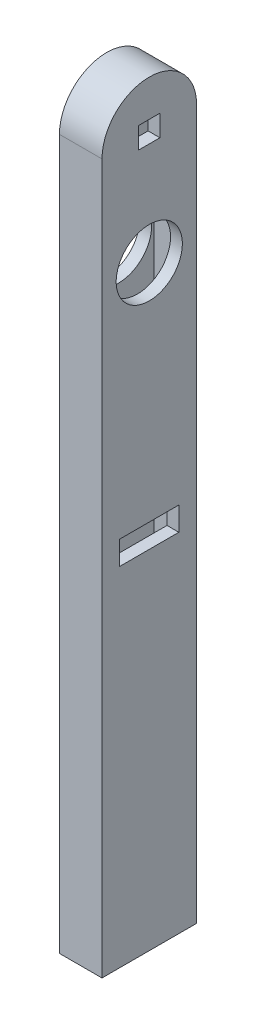
ISO-10303-21;
HEADER;
FILE_DESCRIPTION(('STEP AP214'),'2;1');
FILE_NAME('part.step','',(''),(''),'','','');
FILE_SCHEMA(('AUTOMOTIVE_DESIGN { 1 0 10303 214 1 1 1 1 }'));
ENDSEC;
DATA;
#1=APPLICATION_CONTEXT('core data for automotive mechanical design processes');
#2=APPLICATION_PROTOCOL_DEFINITION('international standard','automotive_design',2000,#1);
#3=PRODUCT_CONTEXT('',#1,'mechanical');
#4=PRODUCT('Part','Part','',(#3));
#5=PRODUCT_RELATED_PRODUCT_CATEGORY('part','',(#4));
#6=PRODUCT_DEFINITION_FORMATION('','',#4);
#7=PRODUCT_DEFINITION_CONTEXT('part definition',#1,'design');
#8=PRODUCT_DEFINITION('design','',#6,#7);
#9=PRODUCT_DEFINITION_SHAPE('','',#8);
#10=(LENGTH_UNIT() NAMED_UNIT(*) SI_UNIT(.MILLI.,.METRE.));
#11=(NAMED_UNIT(*) PLANE_ANGLE_UNIT() SI_UNIT($,.RADIAN.));
#12=(NAMED_UNIT(*) SI_UNIT($,.STERADIAN.) SOLID_ANGLE_UNIT());
#13=UNCERTAINTY_MEASURE_WITH_UNIT(LENGTH_MEASURE(1.E-05),#10,'distance_accuracy_value','');
#14=(GEOMETRIC_REPRESENTATION_CONTEXT(3) GLOBAL_UNCERTAINTY_ASSIGNED_CONTEXT((#13)) GLOBAL_UNIT_ASSIGNED_CONTEXT((#10,
#11,#12)) REPRESENTATION_CONTEXT('',''));
#15=CARTESIAN_POINT('',(0.,0.,0.));
#16=DIRECTION('',(0.,0.,1.));
#17=DIRECTION('',(1.,0.,0.));
#18=AXIS2_PLACEMENT_3D('',#15,#16,#17);
#19=CARTESIAN_POINT('',(-4.,0.,-4.5));
#20=DIRECTION('',(0.,0.,1.));
#21=DIRECTION('',(1.,0.,0.));
#22=AXIS2_PLACEMENT_3D('',#19,#20,#21);
#23=PLANE('',#22);
#24=DIRECTION('',(0.,1.,0.));
#25=VECTOR('',#24,1.);
#26=CARTESIAN_POINT('',(-9.,0.,-4.5));
#27=LINE('',#26,#25);
#28=CARTESIAN_POINT('',(-9.,43.5,-4.5));
#29=VERTEX_POINT('',#28);
#30=CARTESIAN_POINT('',(-9.,52.5,-4.5));
#31=VERTEX_POINT('',#30);
#32=EDGE_CURVE('E324',#29,#31,#27,.T.);
#33=ORIENTED_EDGE('',*,*,#32,.F.);
#34=DIRECTION('',(-1.,0.,0.));
#35=VECTOR('',#34,1.);
#36=CARTESIAN_POINT('',(-4.,43.5,-4.5));
#37=LINE('',#36,#35);
#38=CARTESIAN_POINT('',(-4.,43.5,-4.5));
#39=VERTEX_POINT('',#38);
#40=EDGE_CURVE('E11',#39,#29,#37,.T.);
#41=ORIENTED_EDGE('',*,*,#40,.F.);
#42=DIRECTION('',(0.,1.,0.));
#43=VECTOR('',#42,1.);
#44=CARTESIAN_POINT('',(-4.,0.,-4.5));
#45=LINE('',#44,#43);
#46=CARTESIAN_POINT('',(-4.,52.5,-4.5));
#47=VERTEX_POINT('',#46);
#48=EDGE_CURVE('E298',#39,#47,#45,.T.);
#49=ORIENTED_EDGE('',*,*,#48,.T.);
#50=DIRECTION('',(-1.,0.,0.));
#51=VECTOR('',#50,1.);
#52=CARTESIAN_POINT('',(-4.,52.5,-4.5));
#53=LINE('',#52,#51);
#54=EDGE_CURVE('E335',#47,#31,#53,.T.);
#55=ORIENTED_EDGE('',*,*,#54,.T.);
#56=EDGE_LOOP('',(#33,#41,#49,#55));
#57=FACE_BOUND('',#56,.T.);
#58=ADVANCED_FACE('F34',(#57),#23,.T.);
#59=CARTESIAN_POINT('',(-4.,43.5,0.));
#60=DIRECTION('',(0.,1.,0.));
#61=DIRECTION('',(0.,0.,1.));
#62=AXIS2_PLACEMENT_3D('',#59,#60,#61);
#63=PLANE('',#62);
#64=DIRECTION('',(0.,0.,-1.));
#65=VECTOR('',#64,1.);
#66=CARTESIAN_POINT('',(-9.,43.5,0.));
#67=LINE('',#66,#65);
#68=CARTESIAN_POINT('',(-9.,43.5,4.5));
#69=VERTEX_POINT('',#68);
#70=EDGE_CURVE('E327',#69,#29,#67,.T.);
#71=ORIENTED_EDGE('',*,*,#70,.F.);
#72=DIRECTION('',(-1.,0.,0.));
#73=VECTOR('',#72,1.);
#74=CARTESIAN_POINT('',(-4.,43.5,4.5));
#75=LINE('',#74,#73);
#76=CARTESIAN_POINT('',(-4.,43.5,4.5));
#77=VERTEX_POINT('',#76);
#78=EDGE_CURVE('E43',#77,#69,#75,.T.);
#79=ORIENTED_EDGE('',*,*,#78,.F.);
#80=DIRECTION('',(0.,0.,-1.));
#81=VECTOR('',#80,1.);
#82=CARTESIAN_POINT('',(-4.,43.5,0.));
#83=LINE('',#82,#81);
#84=EDGE_CURVE('E302',#77,#39,#83,.T.);
#85=ORIENTED_EDGE('',*,*,#84,.T.);
#86=ORIENTED_EDGE('',*,*,#40,.T.);
#87=EDGE_LOOP('',(#71,#79,#85,#86));
#88=FACE_BOUND('',#87,.T.);
#89=ADVANCED_FACE('F377',(#88),#63,.T.);
#90=CARTESIAN_POINT('',(-4.,0.,4.5));
#91=DIRECTION('',(0.,0.,1.));
#92=DIRECTION('',(1.,0.,0.));
#93=AXIS2_PLACEMENT_3D('',#90,#91,#92);
#94=PLANE('',#93);
#95=DIRECTION('',(0.,1.,0.));
#96=VECTOR('',#95,1.);
#97=CARTESIAN_POINT('',(-9.,0.,4.5));
#98=LINE('',#97,#96);
#99=CARTESIAN_POINT('',(-9.,52.5,4.5));
#100=VERTEX_POINT('',#99);
#101=EDGE_CURVE('E330',#69,#100,#98,.T.);
#102=ORIENTED_EDGE('',*,*,#101,.T.);
#103=DIRECTION('',(-1.,0.,0.));
#104=VECTOR('',#103,1.);
#105=CARTESIAN_POINT('',(-4.,52.5,4.5));
#106=LINE('',#105,#104);
#107=CARTESIAN_POINT('',(-4.,52.5,4.5));
#108=VERTEX_POINT('',#107);
#109=EDGE_CURVE('E337',#108,#100,#106,.T.);
#110=ORIENTED_EDGE('',*,*,#109,.F.);
#111=DIRECTION('',(0.,1.,0.));
#112=VECTOR('',#111,1.);
#113=CARTESIAN_POINT('',(-4.,0.,4.5));
#114=LINE('',#113,#112);
#115=EDGE_CURVE('E305',#77,#108,#114,.T.);
#116=ORIENTED_EDGE('',*,*,#115,.F.);
#117=ORIENTED_EDGE('',*,*,#78,.T.);
#118=EDGE_LOOP('',(#102,#110,#116,#117));
#119=FACE_BOUND('',#118,.T.);
#120=ADVANCED_FACE('F383',(#119),#94,.F.);
#121=CARTESIAN_POINT('',(-4.,48.,0.));
#122=DIRECTION('',(-1.,0.,0.));
#123=DIRECTION('',(0.,0.,1.));
#124=AXIS2_PLACEMENT_3D('',#121,#122,#123);
#125=CYLINDRICAL_SURFACE('',#124,20.);
#126=CARTESIAN_POINT('',(-9.,48.,0.));
#127=DIRECTION('',(1.,0.,0.));
#128=DIRECTION('',(0.,0.,-1.));
#129=AXIS2_PLACEMENT_3D('',#126,#127,#128);
#130=CIRCLE('',#129,20.);
#131=CARTESIAN_POINT('',(-9.,48.,20.));
#132=VERTEX_POINT('',#131);
#133=CARTESIAN_POINT('',(-9.,48.,-20.));
#134=VERTEX_POINT('',#133);
#135=EDGE_CURVE('E294',#132,#134,#130,.F.);
#136=ORIENTED_EDGE('',*,*,#135,.F.);
#137=DIRECTION('',(-1.,0.,0.));
#138=VECTOR('',#137,1.);
#139=CARTESIAN_POINT('',(-4.,48.,20.));
#140=LINE('',#139,#138);
#141=CARTESIAN_POINT('',(9.,48.,20.));
#142=VERTEX_POINT('',#141);
#143=EDGE_CURVE('E38',#142,#132,#140,.T.);
#144=ORIENTED_EDGE('',*,*,#143,.F.);
#145=CARTESIAN_POINT('',(9.,48.,0.));
#146=DIRECTION('',(1.,0.,0.));
#147=DIRECTION('',(0.,0.,-1.));
#148=AXIS2_PLACEMENT_3D('',#145,#146,#147);
#149=CIRCLE('',#148,20.);
#150=CARTESIAN_POINT('',(9.,48.,-20.));
#151=VERTEX_POINT('',#150);
#152=EDGE_CURVE('E222',#142,#151,#149,.F.);
#153=ORIENTED_EDGE('',*,*,#152,.T.);
#154=DIRECTION('',(-1.,0.,0.));
#155=VECTOR('',#154,1.);
#156=CARTESIAN_POINT('',(-4.,48.,-20.));
#157=LINE('',#156,#155);
#158=EDGE_CURVE('E310',#151,#134,#157,.T.);
#159=ORIENTED_EDGE('',*,*,#158,.T.);
#160=EDGE_LOOP('',(#136,#144,#153,#159));
#161=FACE_BOUND('',#160,.T.);
#162=ADVANCED_FACE('F36',(#161),#125,.T.);
#163=CARTESIAN_POINT('',(-4.,0.,20.));
#164=DIRECTION('',(0.,0.,-1.));
#165=DIRECTION('',(0.,1.,0.));
#166=AXIS2_PLACEMENT_3D('',#163,#164,#165);
#167=PLANE('',#166);
#168=DIRECTION('',(0.,-1.,0.));
#169=VECTOR('',#168,1.);
#170=CARTESIAN_POINT('',(-9.,0.,20.));
#171=LINE('',#170,#169);
#172=CARTESIAN_POINT('',(-9.,-252.,20.));
#173=VERTEX_POINT('',#172);
#174=EDGE_CURVE('E313',#132,#173,#171,.T.);
#175=ORIENTED_EDGE('',*,*,#174,.T.);
#176=DIRECTION('',(-1.,0.,0.));
#177=VECTOR('',#176,1.);
#178=CARTESIAN_POINT('',(-4.,-252.,20.));
#179=LINE('',#178,#177);
#180=CARTESIAN_POINT('',(9.,-252.,20.));
#181=VERTEX_POINT('',#180);
#182=EDGE_CURVE('E343',#181,#173,#179,.T.);
#183=ORIENTED_EDGE('',*,*,#182,.F.);
#184=DIRECTION('',(0.,-1.,0.));
#185=VECTOR('',#184,1.);
#186=CARTESIAN_POINT('',(9.,0.,20.));
#187=LINE('',#186,#185);
#188=EDGE_CURVE('E240',#142,#181,#187,.T.);
#189=ORIENTED_EDGE('',*,*,#188,.F.);
#190=ORIENTED_EDGE('',*,*,#143,.T.);
#191=EDGE_LOOP('',(#175,#183,#189,#190));
#192=FACE_BOUND('',#191,.T.);
#193=ADVANCED_FACE('F351',(#192),#167,.F.);
#194=CARTESIAN_POINT('',(-4.,-252.,0.));
#195=DIRECTION('',(0.,1.,0.));
#196=DIRECTION('',(0.,0.,1.));
#197=AXIS2_PLACEMENT_3D('',#194,#195,#196);
#198=PLANE('',#197);
#199=DIRECTION('',(0.,0.,-1.));
#200=VECTOR('',#199,1.);
#201=CARTESIAN_POINT('',(-9.,-252.,0.));
#202=LINE('',#201,#200);
#203=CARTESIAN_POINT('',(-9.,-252.,-20.));
#204=VERTEX_POINT('',#203);
#205=EDGE_CURVE('E315',#173,#204,#202,.T.);
#206=ORIENTED_EDGE('',*,*,#205,.T.);
#207=DIRECTION('',(-1.,0.,0.));
#208=VECTOR('',#207,1.);
#209=CARTESIAN_POINT('',(-4.,-252.,-20.));
#210=LINE('',#209,#208);
#211=CARTESIAN_POINT('',(9.,-252.,-20.));
#212=VERTEX_POINT('',#211);
#213=EDGE_CURVE('E342',#212,#204,#210,.T.);
#214=ORIENTED_EDGE('',*,*,#213,.F.);
#215=DIRECTION('',(0.,0.,-1.));
#216=VECTOR('',#215,1.);
#217=CARTESIAN_POINT('',(9.,-252.,0.));
#218=LINE('',#217,#216);
#219=EDGE_CURVE('E243',#181,#212,#218,.T.);
#220=ORIENTED_EDGE('',*,*,#219,.F.);
#221=ORIENTED_EDGE('',*,*,#182,.T.);
#222=EDGE_LOOP('',(#206,#214,#220,#221));
#223=FACE_BOUND('',#222,.T.);
#224=ADVANCED_FACE('F365',(#223),#198,.F.);
#225=CARTESIAN_POINT('',(-4.,0.,0.));
#226=DIRECTION('',(-1.,0.,0.));
#227=DIRECTION('',(0.,0.,1.));
#228=AXIS2_PLACEMENT_3D('',#225,#226,#227);
#229=CYLINDRICAL_SURFACE('',#228,14.);
#230=CARTESIAN_POINT('',(-4.,0.,0.));
#231=DIRECTION('',(1.,0.,0.));
#232=DIRECTION('',(0.,0.,-1.));
#233=AXIS2_PLACEMENT_3D('',#230,#231,#232);
#234=CIRCLE('',#233,14.);
#235=CARTESIAN_POINT('',(-4.,0.,-14.));
#236=VERTEX_POINT('',#235);
#237=EDGE_CURVE('E295',#236,#236,#234,.T.);
#238=ORIENTED_EDGE('',*,*,#237,.T.);
#239=EDGE_LOOP('',(#238));
#240=FACE_BOUND('',#239,.T.);
#241=CARTESIAN_POINT('',(-9.,0.,0.));
#242=DIRECTION('',(1.,0.,0.));
#243=DIRECTION('',(0.,0.,-1.));
#244=AXIS2_PLACEMENT_3D('',#241,#242,#243);
#245=CIRCLE('',#244,14.);
#246=CARTESIAN_POINT('',(-9.,0.,-14.));
#247=VERTEX_POINT('',#246);
#248=EDGE_CURVE('E321',#247,#247,#245,.T.);
#249=ORIENTED_EDGE('',*,*,#248,.F.);
#250=EDGE_LOOP('',(#249));
#251=FACE_BOUND('',#250,.T.);
#252=ADVANCED_FACE('F367',(#240,#251),#229,.F.);
#253=CARTESIAN_POINT('',(-4.,0.,-20.));
#254=DIRECTION('',(0.,0.,-1.));
#255=DIRECTION('',(0.,1.,0.));
#256=AXIS2_PLACEMENT_3D('',#253,#254,#255);
#257=PLANE('',#256);
#258=DIRECTION('',(0.,-1.,0.));
#259=VECTOR('',#258,1.);
#260=CARTESIAN_POINT('',(-9.,0.,-20.));
#261=LINE('',#260,#259);
#262=EDGE_CURVE('E318',#134,#204,#261,.T.);
#263=ORIENTED_EDGE('',*,*,#262,.F.);
#264=ORIENTED_EDGE('',*,*,#158,.F.);
#265=DIRECTION('',(0.,-1.,0.));
#266=VECTOR('',#265,1.);
#267=CARTESIAN_POINT('',(9.,0.,-20.));
#268=LINE('',#267,#266);
#269=EDGE_CURVE('E246',#151,#212,#268,.T.);
#270=ORIENTED_EDGE('',*,*,#269,.T.);
#271=ORIENTED_EDGE('',*,*,#213,.T.);
#272=EDGE_LOOP('',(#263,#264,#270,#271));
#273=FACE_BOUND('',#272,.T.);
#274=ADVANCED_FACE('F361',(#273),#257,.T.);
#275=CARTESIAN_POINT('',(-4.,52.5,0.));
#276=DIRECTION('',(0.,1.,0.));
#277=DIRECTION('',(0.,0.,1.));
#278=AXIS2_PLACEMENT_3D('',#275,#276,#277);
#279=PLANE('',#278);
#280=DIRECTION('',(0.,0.,-1.));
#281=VECTOR('',#280,1.);
#282=CARTESIAN_POINT('',(-9.,52.5,0.));
#283=LINE('',#282,#281);
#284=EDGE_CURVE('E299',#100,#31,#283,.T.);
#285=ORIENTED_EDGE('',*,*,#284,.T.);
#286=ORIENTED_EDGE('',*,*,#54,.F.);
#287=DIRECTION('',(0.,0.,-1.));
#288=VECTOR('',#287,1.);
#289=CARTESIAN_POINT('',(-4.,52.5,0.));
#290=LINE('',#289,#288);
#291=EDGE_CURVE('E308',#108,#47,#290,.T.);
#292=ORIENTED_EDGE('',*,*,#291,.F.);
#293=ORIENTED_EDGE('',*,*,#109,.T.);
#294=EDGE_LOOP('',(#285,#286,#292,#293));
#295=FACE_BOUND('',#294,.T.);
#296=ADVANCED_FACE('F389',(#295),#279,.F.);
#297=CARTESIAN_POINT('',(-4.,0.,0.));
#298=DIRECTION('',(1.,0.,0.));
#299=DIRECTION('',(0.,0.,-1.));
#300=AXIS2_PLACEMENT_3D('',#297,#298,#299);
#301=PLANE('',#300);
#302=DIRECTION('',(0.,0.,-1.));
#303=VECTOR('',#302,1.);
#304=CARTESIAN_POINT('',(-4.,-247.,0.));
#305=LINE('',#304,#303);
#306=CARTESIAN_POINT('',(-4.,-247.,15.));
#307=VERTEX_POINT('',#306);
#308=CARTESIAN_POINT('',(-4.,-247.,-15.));
#309=VERTEX_POINT('',#308);
#310=EDGE_CURVE('E280',#307,#309,#305,.T.);
#311=ORIENTED_EDGE('',*,*,#310,.T.);
#312=DIRECTION('',(0.,-1.,0.));
#313=VECTOR('',#312,1.);
#314=CARTESIAN_POINT('',(-4.,0.,-15.));
#315=LINE('',#314,#313);
#316=CARTESIAN_POINT('',(-4.,48.,-15.));
#317=VERTEX_POINT('',#316);
#318=EDGE_CURVE('E277',#317,#309,#315,.T.);
#319=ORIENTED_EDGE('',*,*,#318,.F.);
#320=CARTESIAN_POINT('',(-4.,48.,0.));
#321=DIRECTION('',(1.,0.,0.));
#322=DIRECTION('',(0.,0.,-1.));
#323=AXIS2_PLACEMENT_3D('',#320,#321,#322);
#324=CIRCLE('',#323,15.);
#325=CARTESIAN_POINT('',(-4.,48.,15.));
#326=VERTEX_POINT('',#325);
#327=EDGE_CURVE('E274',#326,#317,#324,.F.);
#328=ORIENTED_EDGE('',*,*,#327,.F.);
#329=DIRECTION('',(0.,-1.,0.));
#330=VECTOR('',#329,1.);
#331=CARTESIAN_POINT('',(-4.,0.,15.));
#332=LINE('',#331,#330);
#333=EDGE_CURVE('E272',#326,#307,#332,.T.);
#334=ORIENTED_EDGE('',*,*,#333,.T.);
#335=EDGE_LOOP('',(#311,#319,#328,#334));
#336=FACE_BOUND('',#335,.T.);
#337=ORIENTED_EDGE('',*,*,#237,.F.);
#338=EDGE_LOOP('',(#337));
#339=FACE_BOUND('',#338,.T.);
#340=ORIENTED_EDGE('',*,*,#48,.F.);
#341=ORIENTED_EDGE('',*,*,#84,.F.);
#342=ORIENTED_EDGE('',*,*,#115,.T.);
#343=ORIENTED_EDGE('',*,*,#291,.T.);
#344=EDGE_LOOP('',(#340,#341,#342,#343));
#345=FACE_BOUND('',#344,.T.);
#346=ADVANCED_FACE('F393',(#336,#339,#345),#301,.T.);
#347=CARTESIAN_POINT('',(-9.,0.,0.));
#348=DIRECTION('',(1.,0.,0.));
#349=DIRECTION('',(0.,0.,-1.));
#350=AXIS2_PLACEMENT_3D('',#347,#348,#349);
#351=PLANE('',#350);
#352=ORIENTED_EDGE('',*,*,#135,.T.);
#353=ORIENTED_EDGE('',*,*,#262,.T.);
#354=ORIENTED_EDGE('',*,*,#205,.F.);
#355=ORIENTED_EDGE('',*,*,#174,.F.);
#356=EDGE_LOOP('',(#352,#353,#354,#355));
#357=FACE_BOUND('',#356,.T.);
#358=ORIENTED_EDGE('',*,*,#248,.T.);
#359=EDGE_LOOP('',(#358));
#360=FACE_BOUND('',#359,.T.);
#361=ORIENTED_EDGE('',*,*,#32,.T.);
#362=ORIENTED_EDGE('',*,*,#284,.F.);
#363=ORIENTED_EDGE('',*,*,#101,.F.);
#364=ORIENTED_EDGE('',*,*,#70,.T.);
#365=EDGE_LOOP('',(#361,#362,#363,#364));
#366=FACE_BOUND('',#365,.T.);
#367=ADVANCED_FACE('F356',(#357,#360,#366),#351,.F.);
#368=CARTESIAN_POINT('',(322.490309931942,-247.,0.));
#369=DIRECTION('',(0.,1.,0.));
#370=DIRECTION('',(0.,0.,1.));
#371=AXIS2_PLACEMENT_3D('',#368,#369,#370);
#372=PLANE('',#371);
#373=DIRECTION('',(-1.,0.,0.));
#374=VECTOR('',#373,1.);
#375=CARTESIAN_POINT('',(322.490309931942,-247.,15.));
#376=LINE('',#375,#374);
#377=CARTESIAN_POINT('',(4.,-247.,15.));
#378=VERTEX_POINT('',#377);
#379=EDGE_CURVE('E282',#378,#307,#376,.T.);
#380=ORIENTED_EDGE('',*,*,#379,.F.);
#381=DIRECTION('',(0.,0.,-1.));
#382=VECTOR('',#381,1.);
#383=CARTESIAN_POINT('',(4.,-247.,0.));
#384=LINE('',#383,#382);
#385=CARTESIAN_POINT('',(4.,-247.,-15.));
#386=VERTEX_POINT('',#385);
#387=EDGE_CURVE('E219',#378,#386,#384,.T.);
#388=ORIENTED_EDGE('',*,*,#387,.T.);
#389=DIRECTION('',(-1.,0.,0.));
#390=VECTOR('',#389,1.);
#391=CARTESIAN_POINT('',(322.490309931942,-247.,-15.));
#392=LINE('',#391,#390);
#393=EDGE_CURVE('E285',#386,#309,#392,.T.);
#394=ORIENTED_EDGE('',*,*,#393,.T.);
#395=ORIENTED_EDGE('',*,*,#310,.F.);
#396=EDGE_LOOP('',(#380,#388,#394,#395));
#397=FACE_BOUND('',#396,.T.);
#398=ADVANCED_FACE('F417',(#397),#372,.T.);
#399=CARTESIAN_POINT('',(322.490309931942,0.,-15.));
#400=DIRECTION('',(0.,0.,-1.));
#401=DIRECTION('',(0.,1.,0.));
#402=AXIS2_PLACEMENT_3D('',#399,#400,#401);
#403=PLANE('',#402);
#404=ORIENTED_EDGE('',*,*,#393,.F.);
#405=DIRECTION('',(0.,-1.,0.));
#406=VECTOR('',#405,1.);
#407=CARTESIAN_POINT('',(4.,0.,-15.));
#408=LINE('',#407,#406);
#409=CARTESIAN_POINT('',(4.,48.,-15.));
#410=VERTEX_POINT('',#409);
#411=EDGE_CURVE('E216',#410,#386,#408,.T.);
#412=ORIENTED_EDGE('',*,*,#411,.F.);
#413=DIRECTION('',(-1.,0.,0.));
#414=VECTOR('',#413,1.);
#415=CARTESIAN_POINT('',(322.490309931942,48.,-15.));
#416=LINE('',#415,#414);
#417=EDGE_CURVE('E288',#410,#317,#416,.T.);
#418=ORIENTED_EDGE('',*,*,#417,.T.);
#419=ORIENTED_EDGE('',*,*,#318,.T.);
#420=EDGE_LOOP('',(#404,#412,#418,#419));
#421=FACE_BOUND('',#420,.T.);
#422=ADVANCED_FACE('F421',(#421),#403,.F.);
#423=CARTESIAN_POINT('',(322.490309931942,48.,0.));
#424=DIRECTION('',(-1.,0.,0.));
#425=DIRECTION('',(0.,0.,1.));
#426=AXIS2_PLACEMENT_3D('',#423,#424,#425);
#427=CYLINDRICAL_SURFACE('',#426,15.);
#428=ORIENTED_EDGE('',*,*,#417,.F.);
#429=CARTESIAN_POINT('',(4.,48.,0.));
#430=DIRECTION('',(1.,0.,0.));
#431=DIRECTION('',(0.,0.,-1.));
#432=AXIS2_PLACEMENT_3D('',#429,#430,#431);
#433=CIRCLE('',#432,15.);
#434=CARTESIAN_POINT('',(4.,48.,15.));
#435=VERTEX_POINT('',#434);
#436=EDGE_CURVE('E213',#435,#410,#433,.F.);
#437=ORIENTED_EDGE('',*,*,#436,.F.);
#438=DIRECTION('',(-1.,0.,0.));
#439=VECTOR('',#438,1.);
#440=CARTESIAN_POINT('',(322.490309931942,48.,15.));
#441=LINE('',#440,#439);
#442=EDGE_CURVE('E291',#435,#326,#441,.T.);
#443=ORIENTED_EDGE('',*,*,#442,.T.);
#444=ORIENTED_EDGE('',*,*,#327,.T.);
#445=EDGE_LOOP('',(#428,#437,#443,#444));
#446=FACE_BOUND('',#445,.T.);
#447=ADVANCED_FACE('F427',(#446),#427,.F.);
#448=CARTESIAN_POINT('',(322.490309931942,0.,15.));
#449=DIRECTION('',(0.,0.,-1.));
#450=DIRECTION('',(0.,1.,0.));
#451=AXIS2_PLACEMENT_3D('',#448,#449,#450);
#452=PLANE('',#451);
#453=ORIENTED_EDGE('',*,*,#442,.F.);
#454=DIRECTION('',(0.,-1.,0.));
#455=VECTOR('',#454,1.);
#456=CARTESIAN_POINT('',(4.,0.,15.));
#457=LINE('',#456,#455);
#458=EDGE_CURVE('E210',#435,#378,#457,.T.);
#459=ORIENTED_EDGE('',*,*,#458,.T.);
#460=ORIENTED_EDGE('',*,*,#379,.T.);
#461=ORIENTED_EDGE('',*,*,#333,.F.);
#462=EDGE_LOOP('',(#453,#459,#460,#461));
#463=FACE_BOUND('',#462,.T.);
#464=ADVANCED_FACE('F436',(#463),#452,.T.);
#465=CARTESIAN_POINT('',(4.,0.,-4.5));
#466=DIRECTION('',(0.,0.,1.));
#467=DIRECTION('',(-1.,0.,0.));
#468=AXIS2_PLACEMENT_3D('',#465,#466,#467);
#469=PLANE('',#468);
#470=DIRECTION('',(0.,1.,0.));
#471=VECTOR('',#470,1.);
#472=CARTESIAN_POINT('',(9.,0.,-4.5));
#473=LINE('',#472,#471);
#474=CARTESIAN_POINT('',(9.,43.5,-4.5));
#475=VERTEX_POINT('',#474);
#476=CARTESIAN_POINT('',(9.,52.5,-4.5));
#477=VERTEX_POINT('',#476);
#478=EDGE_CURVE('E252',#475,#477,#473,.T.);
#479=ORIENTED_EDGE('',*,*,#478,.T.);
#480=DIRECTION('',(1.,0.,0.));
#481=VECTOR('',#480,1.);
#482=CARTESIAN_POINT('',(4.,52.5,-4.5));
#483=LINE('',#482,#481);
#484=CARTESIAN_POINT('',(4.,52.5,-4.5));
#485=VERTEX_POINT('',#484);
#486=EDGE_CURVE('E237',#485,#477,#483,.T.);
#487=ORIENTED_EDGE('',*,*,#486,.F.);
#488=DIRECTION('',(0.,1.,0.));
#489=VECTOR('',#488,1.);
#490=CARTESIAN_POINT('',(4.,0.,-4.5));
#491=LINE('',#490,#489);
#492=CARTESIAN_POINT('',(4.,43.5,-4.5));
#493=VERTEX_POINT('',#492);
#494=EDGE_CURVE('E226',#493,#485,#491,.T.);
#495=ORIENTED_EDGE('',*,*,#494,.F.);
#496=DIRECTION('',(1.,0.,0.));
#497=VECTOR('',#496,1.);
#498=CARTESIAN_POINT('',(4.,43.5,-4.5));
#499=LINE('',#498,#497);
#500=EDGE_CURVE('E269',#493,#475,#499,.T.);
#501=ORIENTED_EDGE('',*,*,#500,.T.);
#502=EDGE_LOOP('',(#479,#487,#495,#501));
#503=FACE_BOUND('',#502,.T.);
#504=ADVANCED_FACE('F439',(#503),#469,.T.);
#505=CARTESIAN_POINT('',(4.,43.5,0.));
#506=DIRECTION('',(0.,1.,0.));
#507=DIRECTION('',(0.,0.,1.));
#508=AXIS2_PLACEMENT_3D('',#505,#506,#507);
#509=PLANE('',#508);
#510=DIRECTION('',(0.,0.,-1.));
#511=VECTOR('',#510,1.);
#512=CARTESIAN_POINT('',(9.,43.5,0.));
#513=LINE('',#512,#511);
#514=CARTESIAN_POINT('',(9.,43.5,4.5));
#515=VERTEX_POINT('',#514);
#516=EDGE_CURVE('E255',#515,#475,#513,.T.);
#517=ORIENTED_EDGE('',*,*,#516,.T.);
#518=ORIENTED_EDGE('',*,*,#500,.F.);
#519=DIRECTION('',(0.,0.,-1.));
#520=VECTOR('',#519,1.);
#521=CARTESIAN_POINT('',(4.,43.5,0.));
#522=LINE('',#521,#520);
#523=CARTESIAN_POINT('',(4.,43.5,4.5));
#524=VERTEX_POINT('',#523);
#525=EDGE_CURVE('E230',#524,#493,#522,.T.);
#526=ORIENTED_EDGE('',*,*,#525,.F.);
#527=DIRECTION('',(1.,0.,0.));
#528=VECTOR('',#527,1.);
#529=CARTESIAN_POINT('',(4.,43.5,4.5));
#530=LINE('',#529,#528);
#531=EDGE_CURVE('E266',#524,#515,#530,.T.);
#532=ORIENTED_EDGE('',*,*,#531,.T.);
#533=EDGE_LOOP('',(#517,#518,#526,#532));
#534=FACE_BOUND('',#533,.T.);
#535=ADVANCED_FACE('F444',(#534),#509,.T.);
#536=CARTESIAN_POINT('',(4.,0.,4.5));
#537=DIRECTION('',(0.,0.,1.));
#538=DIRECTION('',(-1.,0.,0.));
#539=AXIS2_PLACEMENT_3D('',#536,#537,#538);
#540=PLANE('',#539);
#541=DIRECTION('',(0.,1.,0.));
#542=VECTOR('',#541,1.);
#543=CARTESIAN_POINT('',(9.,0.,4.5));
#544=LINE('',#543,#542);
#545=CARTESIAN_POINT('',(9.,52.5,4.5));
#546=VERTEX_POINT('',#545);
#547=EDGE_CURVE('E257',#515,#546,#544,.T.);
#548=ORIENTED_EDGE('',*,*,#547,.F.);
#549=ORIENTED_EDGE('',*,*,#531,.F.);
#550=DIRECTION('',(0.,1.,0.));
#551=VECTOR('',#550,1.);
#552=CARTESIAN_POINT('',(4.,0.,4.5));
#553=LINE('',#552,#551);
#554=CARTESIAN_POINT('',(4.,52.5,4.5));
#555=VERTEX_POINT('',#554);
#556=EDGE_CURVE('E232',#524,#555,#553,.T.);
#557=ORIENTED_EDGE('',*,*,#556,.T.);
#558=DIRECTION('',(1.,0.,0.));
#559=VECTOR('',#558,1.);
#560=CARTESIAN_POINT('',(4.,52.5,4.5));
#561=LINE('',#560,#559);
#562=EDGE_CURVE('E263',#555,#546,#561,.T.);
#563=ORIENTED_EDGE('',*,*,#562,.T.);
#564=EDGE_LOOP('',(#548,#549,#557,#563));
#565=FACE_BOUND('',#564,.T.);
#566=ADVANCED_FACE('F471',(#565),#540,.F.);
#567=CARTESIAN_POINT('',(4.,0.,0.));
#568=DIRECTION('',(1.,0.,0.));
#569=DIRECTION('',(0.,0.,1.));
#570=AXIS2_PLACEMENT_3D('',#567,#568,#569);
#571=CYLINDRICAL_SURFACE('',#570,14.);
#572=CARTESIAN_POINT('',(4.,0.,0.));
#573=DIRECTION('',(1.,0.,0.));
#574=DIRECTION('',(0.,0.,-1.));
#575=AXIS2_PLACEMENT_3D('',#572,#573,#574);
#576=CIRCLE('',#575,14.);
#577=CARTESIAN_POINT('',(4.,0.,-14.));
#578=VERTEX_POINT('',#577);
#579=EDGE_CURVE('E223',#578,#578,#576,.T.);
#580=ORIENTED_EDGE('',*,*,#579,.F.);
#581=EDGE_LOOP('',(#580));
#582=FACE_BOUND('',#581,.T.);
#583=CARTESIAN_POINT('',(9.,0.,0.));
#584=DIRECTION('',(1.,0.,0.));
#585=DIRECTION('',(0.,0.,-1.));
#586=AXIS2_PLACEMENT_3D('',#583,#584,#585);
#587=CIRCLE('',#586,14.);
#588=CARTESIAN_POINT('',(9.,0.,-14.));
#589=VERTEX_POINT('',#588);
#590=EDGE_CURVE('E249',#589,#589,#587,.T.);
#591=ORIENTED_EDGE('',*,*,#590,.T.);
#592=EDGE_LOOP('',(#591));
#593=FACE_BOUND('',#592,.T.);
#594=ADVANCED_FACE('F431',(#582,#593),#571,.F.);
#595=CARTESIAN_POINT('',(4.,52.5,0.));
#596=DIRECTION('',(0.,1.,0.));
#597=DIRECTION('',(0.,0.,1.));
#598=AXIS2_PLACEMENT_3D('',#595,#596,#597);
#599=PLANE('',#598);
#600=DIRECTION('',(0.,0.,-1.));
#601=VECTOR('',#600,1.);
#602=CARTESIAN_POINT('',(9.,52.5,0.));
#603=LINE('',#602,#601);
#604=EDGE_CURVE('E227',#546,#477,#603,.T.);
#605=ORIENTED_EDGE('',*,*,#604,.F.);
#606=ORIENTED_EDGE('',*,*,#562,.F.);
#607=DIRECTION('',(0.,0.,-1.));
#608=VECTOR('',#607,1.);
#609=CARTESIAN_POINT('',(4.,52.5,0.));
#610=LINE('',#609,#608);
#611=EDGE_CURVE('E235',#555,#485,#610,.T.);
#612=ORIENTED_EDGE('',*,*,#611,.T.);
#613=ORIENTED_EDGE('',*,*,#486,.T.);
#614=EDGE_LOOP('',(#605,#606,#612,#613));
#615=FACE_BOUND('',#614,.T.);
#616=ADVANCED_FACE('F458',(#615),#599,.F.);
#617=CARTESIAN_POINT('',(4.,0.,0.));
#618=DIRECTION('',(-1.,0.,0.));
#619=DIRECTION('',(0.,0.,-1.));
#620=AXIS2_PLACEMENT_3D('',#617,#618,#619);
#621=PLANE('',#620);
#622=DIRECTION('',(0.,1.,0.));
#623=VECTOR('',#622,1.);
#624=CARTESIAN_POINT('',(4.,0.,-12.5));
#625=LINE('',#624,#623);
#626=CARTESIAN_POINT('',(4.,-105.,-12.5));
#627=VERTEX_POINT('',#626);
#628=CARTESIAN_POINT('',(4.,-95.,-12.5));
#629=VERTEX_POINT('',#628);
#630=EDGE_CURVE('E186',#627,#629,#625,.T.);
#631=ORIENTED_EDGE('',*,*,#630,.T.);
#632=DIRECTION('',(0.,0.,1.));
#633=VECTOR('',#632,1.);
#634=CARTESIAN_POINT('',(4.,-95.,0.));
#635=LINE('',#634,#633);
#636=CARTESIAN_POINT('',(4.,-95.,12.5));
#637=VERTEX_POINT('',#636);
#638=EDGE_CURVE('E173',#629,#637,#635,.T.);
#639=ORIENTED_EDGE('',*,*,#638,.T.);
#640=DIRECTION('',(0.,-1.,0.));
#641=VECTOR('',#640,1.);
#642=CARTESIAN_POINT('',(4.,0.,12.5));
#643=LINE('',#642,#641);
#644=CARTESIAN_POINT('',(4.,-105.,12.5));
#645=VERTEX_POINT('',#644);
#646=EDGE_CURVE('E205',#637,#645,#643,.T.);
#647=ORIENTED_EDGE('',*,*,#646,.T.);
#648=DIRECTION('',(0.,0.,-1.));
#649=VECTOR('',#648,1.);
#650=CARTESIAN_POINT('',(4.,-105.,0.));
#651=LINE('',#650,#649);
#652=EDGE_CURVE('E194',#645,#627,#651,.T.);
#653=ORIENTED_EDGE('',*,*,#652,.T.);
#654=EDGE_LOOP('',(#631,#639,#647,#653));
#655=FACE_BOUND('',#654,.T.);
#656=ORIENTED_EDGE('',*,*,#387,.F.);
#657=ORIENTED_EDGE('',*,*,#458,.F.);
#658=ORIENTED_EDGE('',*,*,#436,.T.);
#659=ORIENTED_EDGE('',*,*,#411,.T.);
#660=EDGE_LOOP('',(#656,#657,#658,#659));
#661=FACE_BOUND('',#660,.T.);
#662=ORIENTED_EDGE('',*,*,#579,.T.);
#663=EDGE_LOOP('',(#662));
#664=FACE_BOUND('',#663,.T.);
#665=ORIENTED_EDGE('',*,*,#494,.T.);
#666=ORIENTED_EDGE('',*,*,#611,.F.);
#667=ORIENTED_EDGE('',*,*,#556,.F.);
#668=ORIENTED_EDGE('',*,*,#525,.T.);
#669=EDGE_LOOP('',(#665,#666,#667,#668));
#670=FACE_BOUND('',#669,.T.);
#671=ADVANCED_FACE('F192',(#655,#661,#664,#670),#621,.T.);
#672=CARTESIAN_POINT('',(9.,0.,0.));
#673=DIRECTION('',(-1.,0.,0.));
#674=DIRECTION('',(0.,0.,-1.));
#675=AXIS2_PLACEMENT_3D('',#672,#673,#674);
#676=PLANE('',#675);
#677=DIRECTION('',(0.,0.,1.));
#678=VECTOR('',#677,1.);
#679=CARTESIAN_POINT('',(9.,-95.,0.));
#680=LINE('',#679,#678);
#681=CARTESIAN_POINT('',(9.,-95.,-12.5));
#682=VERTEX_POINT('',#681);
#683=CARTESIAN_POINT('',(9.,-95.,12.5));
#684=VERTEX_POINT('',#683);
#685=EDGE_CURVE('E196',#682,#684,#680,.T.);
#686=ORIENTED_EDGE('',*,*,#685,.F.);
#687=DIRECTION('',(0.,1.,0.));
#688=VECTOR('',#687,1.);
#689=CARTESIAN_POINT('',(9.,0.,-12.5));
#690=LINE('',#689,#688);
#691=CARTESIAN_POINT('',(9.,-105.,-12.5));
#692=VERTEX_POINT('',#691);
#693=EDGE_CURVE('E189',#692,#682,#690,.T.);
#694=ORIENTED_EDGE('',*,*,#693,.F.);
#695=DIRECTION('',(0.,0.,-1.));
#696=VECTOR('',#695,1.);
#697=CARTESIAN_POINT('',(9.,-105.,0.));
#698=LINE('',#697,#696);
#699=CARTESIAN_POINT('',(9.,-105.,12.5));
#700=VERTEX_POINT('',#699);
#701=EDGE_CURVE('E201',#700,#692,#698,.T.);
#702=ORIENTED_EDGE('',*,*,#701,.F.);
#703=DIRECTION('',(0.,-1.,0.));
#704=VECTOR('',#703,1.);
#705=CARTESIAN_POINT('',(9.,0.,12.5));
#706=LINE('',#705,#704);
#707=EDGE_CURVE('E59',#684,#700,#706,.T.);
#708=ORIENTED_EDGE('',*,*,#707,.F.);
#709=EDGE_LOOP('',(#686,#694,#702,#708));
#710=FACE_BOUND('',#709,.T.);
#711=ORIENTED_EDGE('',*,*,#152,.F.);
#712=ORIENTED_EDGE('',*,*,#188,.T.);
#713=ORIENTED_EDGE('',*,*,#219,.T.);
#714=ORIENTED_EDGE('',*,*,#269,.F.);
#715=EDGE_LOOP('',(#711,#712,#713,#714));
#716=FACE_BOUND('',#715,.T.);
#717=ORIENTED_EDGE('',*,*,#590,.F.);
#718=EDGE_LOOP('',(#717));
#719=FACE_BOUND('',#718,.T.);
#720=ORIENTED_EDGE('',*,*,#478,.F.);
#721=ORIENTED_EDGE('',*,*,#516,.F.);
#722=ORIENTED_EDGE('',*,*,#547,.T.);
#723=ORIENTED_EDGE('',*,*,#604,.T.);
#724=EDGE_LOOP('',(#720,#721,#722,#723));
#725=FACE_BOUND('',#724,.T.);
#726=ADVANCED_FACE('F363',(#710,#716,#719,#725),#676,.F.);
#727=CARTESIAN_POINT('',(-9.001,0.,-12.5));
#728=DIRECTION('',(0.,0.,-1.));
#729=DIRECTION('',(0.,1.,0.));
#730=AXIS2_PLACEMENT_3D('',#727,#728,#729);
#731=PLANE('',#730);
#732=DIRECTION('',(1.,0.,0.));
#733=VECTOR('',#732,1.);
#734=CARTESIAN_POINT('',(-9.001,-105.,-12.5));
#735=LINE('',#734,#733);
#736=EDGE_CURVE('E51',#627,#692,#735,.T.);
#737=ORIENTED_EDGE('',*,*,#736,.T.);
#738=ORIENTED_EDGE('',*,*,#693,.T.);
#739=DIRECTION('',(1.,0.,0.));
#740=VECTOR('',#739,1.);
#741=CARTESIAN_POINT('',(-9.001,-95.,-12.5));
#742=LINE('',#741,#740);
#743=EDGE_CURVE('E177',#629,#682,#742,.T.);
#744=ORIENTED_EDGE('',*,*,#743,.F.);
#745=ORIENTED_EDGE('',*,*,#630,.F.);
#746=EDGE_LOOP('',(#737,#738,#744,#745));
#747=FACE_BOUND('',#746,.T.);
#748=ADVANCED_FACE('F185',(#747),#731,.F.);
#749=CARTESIAN_POINT('',(-9.001,-95.,0.));
#750=DIRECTION('',(0.,1.,0.));
#751=DIRECTION('',(0.,0.,1.));
#752=AXIS2_PLACEMENT_3D('',#749,#750,#751);
#753=PLANE('',#752);
#754=ORIENTED_EDGE('',*,*,#743,.T.);
#755=ORIENTED_EDGE('',*,*,#685,.T.);
#756=DIRECTION('',(1.,0.,0.));
#757=VECTOR('',#756,1.);
#758=CARTESIAN_POINT('',(-9.001,-95.,12.5));
#759=LINE('',#758,#757);
#760=EDGE_CURVE('E179',#637,#684,#759,.T.);
#761=ORIENTED_EDGE('',*,*,#760,.F.);
#762=ORIENTED_EDGE('',*,*,#638,.F.);
#763=EDGE_LOOP('',(#754,#755,#761,#762));
#764=FACE_BOUND('',#763,.T.);
#765=ADVANCED_FACE('F175',(#764),#753,.F.);
#766=CARTESIAN_POINT('',(-9.001,0.,12.5));
#767=DIRECTION('',(0.,0.,1.));
#768=DIRECTION('',(1.,0.,0.));
#769=AXIS2_PLACEMENT_3D('',#766,#767,#768);
#770=PLANE('',#769);
#771=ORIENTED_EDGE('',*,*,#760,.T.);
#772=ORIENTED_EDGE('',*,*,#707,.T.);
#773=DIRECTION('',(1.,0.,0.));
#774=VECTOR('',#773,1.);
#775=CARTESIAN_POINT('',(-9.001,-105.,12.5));
#776=LINE('',#775,#774);
#777=EDGE_CURVE('E204',#645,#700,#776,.T.);
#778=ORIENTED_EDGE('',*,*,#777,.F.);
#779=ORIENTED_EDGE('',*,*,#646,.F.);
#780=EDGE_LOOP('',(#771,#772,#778,#779));
#781=FACE_BOUND('',#780,.T.);
#782=ADVANCED_FACE('F531',(#781),#770,.F.);
#783=CARTESIAN_POINT('',(-9.001,-105.,0.));
#784=DIRECTION('',(0.,-1.,0.));
#785=DIRECTION('',(0.,0.,-1.));
#786=AXIS2_PLACEMENT_3D('',#783,#784,#785);
#787=PLANE('',#786);
#788=ORIENTED_EDGE('',*,*,#777,.T.);
#789=ORIENTED_EDGE('',*,*,#701,.T.);
#790=ORIENTED_EDGE('',*,*,#736,.F.);
#791=ORIENTED_EDGE('',*,*,#652,.F.);
#792=EDGE_LOOP('',(#788,#789,#790,#791));
#793=FACE_BOUND('',#792,.T.);
#794=ADVANCED_FACE('F540',(#793),#787,.F.);
#795=CLOSED_SHELL('',(#58,#89,#120,#162,#193,#224,#252,#274,#296,#346,#367,#398,#422,#447,#464,
#504,#535,#566,#594,#616,#671,#726,#748,#765,#782,#794));
#796=MANIFOLD_SOLID_BREP('B2',#795);
#797=ADVANCED_BREP_SHAPE_REPRESENTATION('',(#18,#796),#14);
#798=SHAPE_DEFINITION_REPRESENTATION(#9,#797);
ENDSEC;
END-ISO-10303-21;
